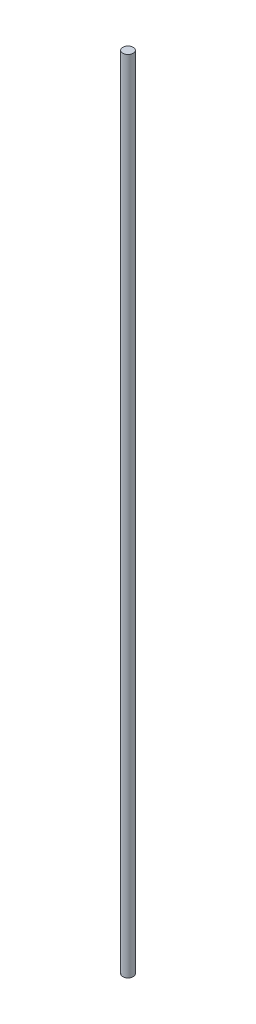
ISO-10303-21;
HEADER;
FILE_DESCRIPTION(('STEP AP214'),'2;1');
FILE_NAME('part.step','',(''),(''),'','','');
FILE_SCHEMA(('AUTOMOTIVE_DESIGN { 1 0 10303 214 1 1 1 1 }'));
ENDSEC;
DATA;
#1=APPLICATION_CONTEXT('core data for automotive mechanical design processes');
#2=APPLICATION_PROTOCOL_DEFINITION('international standard','automotive_design',2000,#1);
#3=PRODUCT_CONTEXT('',#1,'mechanical');
#4=PRODUCT('Part','Part','',(#3));
#5=PRODUCT_RELATED_PRODUCT_CATEGORY('part','',(#4));
#6=PRODUCT_DEFINITION_FORMATION('','',#4);
#7=PRODUCT_DEFINITION_CONTEXT('part definition',#1,'design');
#8=PRODUCT_DEFINITION('design','',#6,#7);
#9=PRODUCT_DEFINITION_SHAPE('','',#8);
#10=(LENGTH_UNIT() NAMED_UNIT(*) SI_UNIT(.MILLI.,.METRE.));
#11=(NAMED_UNIT(*) PLANE_ANGLE_UNIT() SI_UNIT($,.RADIAN.));
#12=(NAMED_UNIT(*) SI_UNIT($,.STERADIAN.) SOLID_ANGLE_UNIT());
#13=UNCERTAINTY_MEASURE_WITH_UNIT(LENGTH_MEASURE(1.E-05),#10,'distance_accuracy_value','');
#14=(GEOMETRIC_REPRESENTATION_CONTEXT(3) GLOBAL_UNCERTAINTY_ASSIGNED_CONTEXT((#13)) GLOBAL_UNIT_ASSIGNED_CONTEXT((#10,
#11,#12)) REPRESENTATION_CONTEXT('',''));
#15=CARTESIAN_POINT('',(0.,0.,0.));
#16=DIRECTION('',(0.,0.,1.));
#17=DIRECTION('',(1.,0.,0.));
#18=AXIS2_PLACEMENT_3D('',#15,#16,#17);
#19=CARTESIAN_POINT('',(0.,628.71,0.));
#20=DIRECTION('',(0.,-1.,0.));
#21=DIRECTION('',(0.,0.,-1.));
#22=AXIS2_PLACEMENT_3D('',#19,#20,#21);
#23=CYLINDRICAL_SURFACE('',#22,4.1);
#24=CARTESIAN_POINT('',(0.,628.71,0.));
#25=DIRECTION('',(0.,1.,0.));
#26=DIRECTION('',(0.,0.,1.));
#27=AXIS2_PLACEMENT_3D('',#24,#25,#26);
#28=CIRCLE('',#27,4.1);
#29=CARTESIAN_POINT('',(0.,628.71,4.1));
#30=VERTEX_POINT('',#29);
#31=EDGE_CURVE('E10',#30,#30,#28,.T.);
#32=ORIENTED_EDGE('',*,*,#31,.F.);
#33=EDGE_LOOP('',(#32));
#34=FACE_BOUND('',#33,.T.);
#35=CARTESIAN_POINT('',(0.,0.,0.));
#36=DIRECTION('',(0.,1.,0.));
#37=DIRECTION('',(0.,0.,1.));
#38=AXIS2_PLACEMENT_3D('',#35,#36,#37);
#39=CIRCLE('',#38,4.1);
#40=CARTESIAN_POINT('',(0.,0.,4.1));
#41=VERTEX_POINT('',#40);
#42=EDGE_CURVE('E37',#41,#41,#39,.T.);
#43=ORIENTED_EDGE('',*,*,#42,.T.);
#44=EDGE_LOOP('',(#43));
#45=FACE_BOUND('',#44,.T.);
#46=ADVANCED_FACE('F34',(#34,#45),#23,.T.);
#47=CARTESIAN_POINT('',(0.,628.71,0.));
#48=DIRECTION('',(0.,1.,0.));
#49=DIRECTION('',(0.,0.,1.));
#50=AXIS2_PLACEMENT_3D('',#47,#48,#49);
#51=PLANE('',#50);
#52=ORIENTED_EDGE('',*,*,#31,.T.);
#53=EDGE_LOOP('',(#52));
#54=FACE_BOUND('',#53,.T.);
#55=ADVANCED_FACE('F49',(#54),#51,.T.);
#56=CARTESIAN_POINT('',(0.,0.,0.));
#57=DIRECTION('',(0.,1.,0.));
#58=DIRECTION('',(0.,0.,1.));
#59=AXIS2_PLACEMENT_3D('',#56,#57,#58);
#60=PLANE('',#59);
#61=ORIENTED_EDGE('',*,*,#42,.F.);
#62=EDGE_LOOP('',(#61));
#63=FACE_BOUND('',#62,.T.);
#64=ADVANCED_FACE('F47',(#63),#60,.F.);
#65=CLOSED_SHELL('',(#46,#55,#64));
#66=MANIFOLD_SOLID_BREP('B2',#65);
#67=ADVANCED_BREP_SHAPE_REPRESENTATION('',(#18,#66),#14);
#68=SHAPE_DEFINITION_REPRESENTATION(#9,#67);
ENDSEC;
END-ISO-10303-21;
